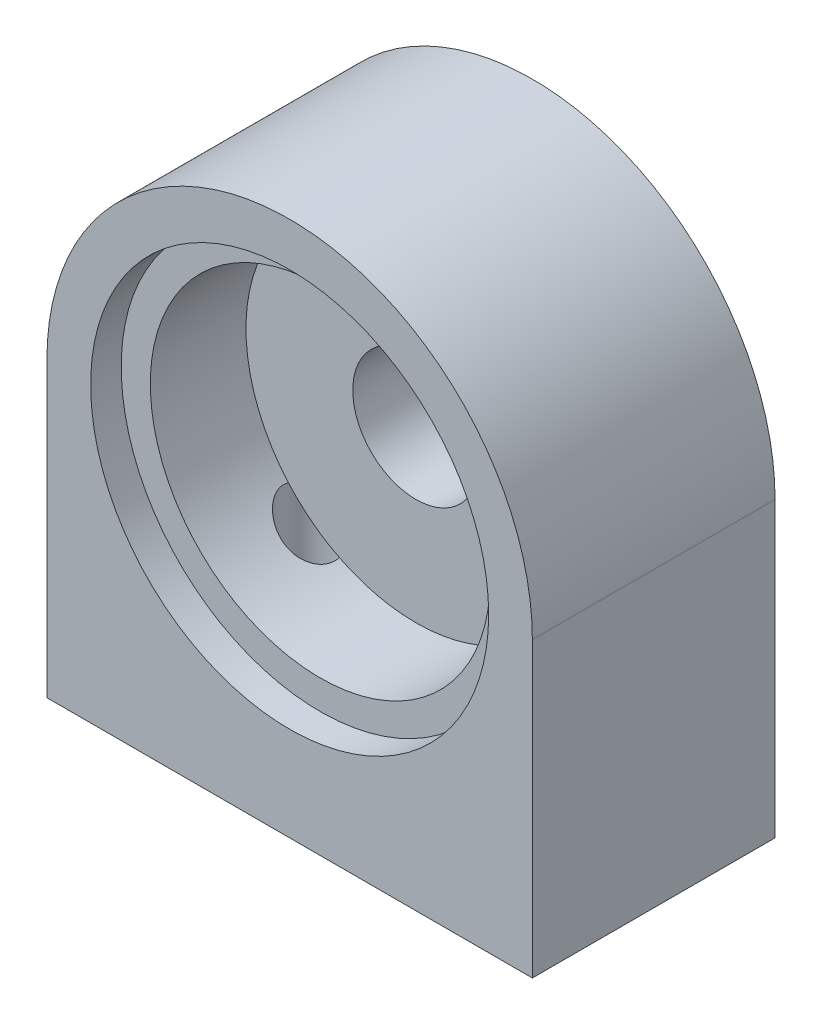
ISO-10303-21;
HEADER;
FILE_DESCRIPTION(('STEP AP214'),'2;1');
FILE_NAME('part.step','',(''),(''),'','','');
FILE_SCHEMA(('AUTOMOTIVE_DESIGN { 1 0 10303 214 1 1 1 1 }'));
ENDSEC;
DATA;
#1=APPLICATION_CONTEXT('core data for automotive mechanical design processes');
#2=APPLICATION_PROTOCOL_DEFINITION('international standard','automotive_design',2000,#1);
#3=PRODUCT_CONTEXT('',#1,'mechanical');
#4=PRODUCT('Part','Part','',(#3));
#5=PRODUCT_RELATED_PRODUCT_CATEGORY('part','',(#4));
#6=PRODUCT_DEFINITION_FORMATION('','',#4);
#7=PRODUCT_DEFINITION_CONTEXT('part definition',#1,'design');
#8=PRODUCT_DEFINITION('design','',#6,#7);
#9=PRODUCT_DEFINITION_SHAPE('','',#8);
#10=(LENGTH_UNIT() NAMED_UNIT(*) SI_UNIT(.MILLI.,.METRE.));
#11=(NAMED_UNIT(*) PLANE_ANGLE_UNIT() SI_UNIT($,.RADIAN.));
#12=(NAMED_UNIT(*) SI_UNIT($,.STERADIAN.) SOLID_ANGLE_UNIT());
#13=UNCERTAINTY_MEASURE_WITH_UNIT(LENGTH_MEASURE(1.E-05),#10,'distance_accuracy_value','');
#14=(GEOMETRIC_REPRESENTATION_CONTEXT(3) GLOBAL_UNCERTAINTY_ASSIGNED_CONTEXT((#13)) GLOBAL_UNIT_ASSIGNED_CONTEXT((#10,
#11,#12)) REPRESENTATION_CONTEXT('',''));
#15=CARTESIAN_POINT('',(0.,0.,0.));
#16=DIRECTION('',(0.,0.,1.));
#17=DIRECTION('',(1.,0.,0.));
#18=AXIS2_PLACEMENT_3D('',#15,#16,#17);
#19=CARTESIAN_POINT('',(12.7,15.33579991,6.096));
#20=DIRECTION('',(0.,0.,1.));
#21=DIRECTION('',(1.,0.,0.));
#22=AXIS2_PLACEMENT_3D('',#19,#20,#21);
#23=CYLINDRICAL_SURFACE('',#22,8.89);
#24=CARTESIAN_POINT('',(12.7,15.33579991,6.096));
#25=DIRECTION('',(0.,0.,1.));
#26=DIRECTION('',(1.,0.,0.));
#27=AXIS2_PLACEMENT_3D('',#24,#25,#26);
#28=CIRCLE('',#27,8.89);
#29=CARTESIAN_POINT('',(8.69448616948013,7.39930452768458,6.096));
#30=VERTEX_POINT('',#29);
#31=CARTESIAN_POINT('',(16.7055138305199,7.39930452768458,6.096));
#32=VERTEX_POINT('',#31);
#33=EDGE_CURVE('E61',#30,#32,#28,.T.);
#34=ORIENTED_EDGE('',*,*,#33,.F.);
#35=CARTESIAN_POINT('',(8.69448616948013,7.39930452768458,6.096));
#36=CARTESIAN_POINT('',(8.70089637097496,7.39607049212058,6.12952031807088));
#37=CARTESIAN_POINT('',(8.70604294261392,7.39348145519207,6.16332870828488));
#38=CARTESIAN_POINT('',(8.71376664533799,7.38960172566352,6.23130981924729));
#39=CARTESIAN_POINT('',(8.71634388724773,7.38831097706351,6.2654825242172));
#40=CARTESIAN_POINT('',(8.72015233335113,7.38640170053647,6.36805368374219));
#41=CARTESIAN_POINT('',(8.71749437283582,7.38772906630197,6.43668367284446));
#42=CARTESIAN_POINT('',(8.70188355730791,7.3955709273081,6.57245364131934));
#43=CARTESIAN_POINT('',(8.68892562519349,7.40208798067248,6.6395928690788));
#44=CARTESIAN_POINT('',(8.65330542406097,7.42019767319402,6.77051971335786));
#45=CARTESIAN_POINT('',(8.6306437216521,7.43179001600272,6.83430752532463));
#46=CARTESIAN_POINT('',(8.57630715812681,7.46000162725195,6.95756458721464));
#47=CARTESIAN_POINT('',(8.54453759153132,7.47667383807152,7.01697975202922));
#48=CARTESIAN_POINT('',(8.47340092368744,7.51470132592697,7.12941269712069));
#49=CARTESIAN_POINT('',(8.43403124601072,7.53605819139054,7.18242829801948));
#50=CARTESIAN_POINT('',(8.34649930960389,7.58455597156986,7.2842367313361));
#51=CARTESIAN_POINT('',(8.29793940099482,7.61197649623298,7.33255318005362));
#52=CARTESIAN_POINT('',(8.19571666357853,7.67113939230621,7.42028240123445));
#53=CARTESIAN_POINT('',(8.14205238196155,7.70288299527022,7.45969262796375));
#54=CARTESIAN_POINT('',(8.02511916213642,7.77387136118261,7.5333188661708));
#55=CARTESIAN_POINT('',(7.9614466270305,7.81355788651306,7.5664648513332));
#56=CARTESIAN_POINT('',(7.83187523920503,7.89675404609957,7.62173970536783));
#57=CARTESIAN_POINT('',(7.76597509934975,7.9402659147546,7.64386208432836));
#58=CARTESIAN_POINT('',(7.62329659569681,8.03732598014006,7.68019433633136));
#59=CARTESIAN_POINT('',(7.54641764865042,8.09138360596089,7.69264274293582));
#60=CARTESIAN_POINT('',(7.39380832052516,8.20240249841608,7.70443122036341));
#61=CARTESIAN_POINT('',(7.31807836773073,8.25936481486146,7.70376651788227));
#62=CARTESIAN_POINT('',(7.15631204737976,8.38512862151658,7.68907030326356));
#63=CARTESIAN_POINT('',(7.07075106254108,8.45427748310855,7.67275296172546));
#64=CARTESIAN_POINT('',(6.9047398887326,8.59348318977863,7.62441089758687));
#65=CARTESIAN_POINT('',(6.82429973228868,8.66354151195699,7.59235635205476));
#66=CARTESIAN_POINT('',(6.66082578807266,8.81092529583536,7.50826517721181));
#67=CARTESIAN_POINT('',(6.57865338662799,8.8881057972255,7.45428184592521));
#68=CARTESIAN_POINT('',(6.42532381718995,9.03723891260022,7.32694455162529));
#69=CARTESIAN_POINT('',(6.35413695546493,9.10920533017818,7.25364430942217));
#70=CARTESIAN_POINT('',(6.25450019466108,9.21286163260283,7.12295995875902));
#71=CARTESIAN_POINT('',(6.22093583351649,9.24844723649692,7.07253697760698));
#72=CARTESIAN_POINT('',(6.15976644651863,9.31421840516282,6.96498501283446));
#73=CARTESIAN_POINT('',(6.13215128724755,9.34441313706371,6.9078676922951));
#74=CARTESIAN_POINT('',(6.08901461301132,9.39207990838386,6.79882668157494));
#75=CARTESIAN_POINT('',(6.07218937546137,9.4108814151464,6.74800856675138));
#76=CARTESIAN_POINT('',(6.04442635296091,9.44208471525503,6.64288298404627));
#77=CARTESIAN_POINT('',(6.03348414363123,9.45449131765009,6.58857817286791));
#78=CARTESIAN_POINT('',(6.0182880108512,9.47175991257454,6.47740658621901));
#79=CARTESIAN_POINT('',(6.01408521478583,9.4765642280896,6.42052356162522));
#80=CARTESIAN_POINT('',(6.01295077813534,9.47785872790981,6.30660114502929));
#81=CARTESIAN_POINT('',(6.01601136075888,9.47435780451205,6.24956198552183));
#82=CARTESIAN_POINT('',(6.02444472675476,9.46476361255789,6.17708404846401));
#83=CARTESIAN_POINT('',(6.02666030346177,9.46224471756416,6.16070159510248));
#84=CARTESIAN_POINT('',(6.0316635419784,9.45656490549535,6.12817574559428));
#85=CARTESIAN_POINT('',(6.03444988536579,9.45340546818806,6.11203188883994));
#86=CARTESIAN_POINT('',(6.03751383051983,9.44993735286462,6.09600000000002));
#87=B_SPLINE_CURVE_WITH_KNOTS('',3,(#35,#36,#37,#38,#39,#40,#41,#42,#43,#44,#45,#46,#47,#48,#49,
#50,#51,#52,#53,#54,#55,#56,#57,#58,#59,#60,#61,#62,#63,#64,#65,#66,#67,#68,#69,#70,#71,#72,#73,
#74,#75,#76,#77,#78,#79,#80,#81,#82,#83,#84,#85,#86),.UNSPECIFIED.,.F.,.F.,(4,2,2,2,2,2,2,2,2,2,
2,2,2,2,2,2,2,2,2,2,2,2,2,2,2,4),(0.,0.102780066951622,0.205555700429577,0.410566471073732,
0.615678359132956,0.820778272213211,1.02809342379216,1.23547897876143,1.45592849911555,
1.67644095277603,1.92155494898295,2.16681308080617,2.45014494705373,2.73357995086712,
3.06590390689593,3.3988600816346,3.77205441541023,4.14422164269421,4.35438413379589,
4.5641857690736,4.7337408613723,4.90316825938211,5.07387500960213,5.24439906912117,
5.29455143621212,5.34458923617784),.UNSPECIFIED.);
#88=CARTESIAN_POINT('',(6.03751383051987,9.44993735286481,6.096));
#89=VERTEX_POINT('',#88);
#90=EDGE_CURVE('E11',#30,#89,#87,.T.);
#91=ORIENTED_EDGE('',*,*,#90,.T.);
#92=CARTESIAN_POINT('',(19.3624861694801,9.44993735286481,6.096));
#93=VERTEX_POINT('',#92);
#94=EDGE_CURVE('E109',#93,#89,#28,.T.);
#95=ORIENTED_EDGE('',*,*,#94,.F.);
#96=CARTESIAN_POINT('',(19.3624861694801,9.44993735286481,6.096));
#97=CARTESIAN_POINT('',(19.3674061420263,9.45550725096371,6.12172390675147));
#98=CARTESIAN_POINT('',(19.3716053919705,9.46027376682763,6.14775230757197));
#99=CARTESIAN_POINT('',(19.3784972042117,9.46810840676736,6.20026520138425));
#100=CARTESIAN_POINT('',(19.3811894274667,9.47117614866157,6.22674979562737));
#101=CARTESIAN_POINT('',(19.3868801513406,9.47766237596015,6.30629634690808));
#102=CARTESIAN_POINT('',(19.3875579405031,9.47843817391137,6.35978801316995));
#103=CARTESIAN_POINT('',(19.38260891038,9.47279312087916,6.4661498673138));
#104=CARTESIAN_POINT('',(19.3769709722857,9.46635957787765,6.51901879305281));
#105=CARTESIAN_POINT('',(19.3598451718809,9.44693529918134,6.62255385861771));
#106=CARTESIAN_POINT('',(19.3483528299407,9.43393954232691,6.67321827934723));
#107=CARTESIAN_POINT('',(19.3166724229339,9.39842334817548,6.78387957663208));
#108=CARTESIAN_POINT('',(19.2950102115752,9.37431505420563,6.84293808904044));
#109=CARTESIAN_POINT('',(19.2452193145333,9.31969034733475,6.95508161086445));
#110=CARTESIAN_POINT('',(19.2170758342762,9.28915928741372,7.0081525332182));
#111=CARTESIAN_POINT('',(19.1429421329572,9.21006770075361,7.12879159523257));
#112=CARTESIAN_POINT('',(19.0943806676925,9.15926739749318,7.19329997205983));
#113=CARTESIAN_POINT('',(18.9894867596642,9.0524806092916,7.31054164016303));
#114=CARTESIAN_POINT('',(18.9331423306139,8.99648616958292,7.36325643401685));
#115=CARTESIAN_POINT('',(18.7970809292713,8.86517444193151,7.47100153245381));
#116=CARTESIAN_POINT('',(18.7153069250019,8.78893775535628,7.52232377162001));
#117=CARTESIAN_POINT('',(18.5437064047285,8.63531505108527,7.6064728965497));
#118=CARTESIAN_POINT('',(18.4538739573816,8.55792822237593,7.63928602722427));
#119=CARTESIAN_POINT('',(18.267639459888,8.40412257796386,7.68568758645734));
#120=CARTESIAN_POINT('',(18.1712030305192,8.32771174464527,7.69916589395077));
#121=CARTESIAN_POINT('',(17.974841125508,8.17875711215418,7.70480807156287));
#122=CARTESIAN_POINT('',(17.8749216172226,8.10620718991907,7.69700678254245));
#123=CARTESIAN_POINT('',(17.6984427681352,7.98349198668911,7.6625905303659));
#124=CARTESIAN_POINT('',(17.6218420166414,7.9320384354365,7.64076031474628));
#125=CARTESIAN_POINT('',(17.4710527388837,7.83398553941833,7.58247882961115));
#126=CARTESIAN_POINT('',(17.3968633831135,7.78738451299175,7.54603264669978));
#127=CARTESIAN_POINT('',(17.2533270320972,7.69993469108688,7.45774303657301));
#128=CARTESIAN_POINT('',(17.1840238552192,7.65913525293212,7.40577795046014));
#129=CARTESIAN_POINT('',(17.0546763297621,7.58502864619417,7.28701612994718));
#130=CARTESIAN_POINT('',(16.9946236836753,7.55171475080487,7.22023281994338));
#131=CARTESIAN_POINT('',(16.8953566898951,7.4978268918612,7.08412410065067));
#132=CARTESIAN_POINT('',(16.8543908167258,7.4761126471687,7.01652588997993));
#133=CARTESIAN_POINT('',(16.7844258743443,7.43952641101453,6.87369866294681));
#134=CARTESIAN_POINT('',(16.7554181843269,7.42464948954837,6.79847519264487));
#135=CARTESIAN_POINT('',(16.7136983757922,7.40341012361535,6.65216181512104));
#136=CARTESIAN_POINT('',(16.6994823993438,7.39625811984842,6.58161006952399));
#137=CARTESIAN_POINT('',(16.6824645650314,7.38770743200455,6.43883515878215));
#138=CARTESIAN_POINT('',(16.6796477709817,7.38630121927631,6.36661430559028));
#139=CARTESIAN_POINT('',(16.6839423009107,7.38845450065019,6.26132324117521));
#140=CARTESIAN_POINT('',(16.686552534026,7.38976194496679,6.22795563841931));
#141=CARTESIAN_POINT('',(16.6942161278778,7.39361167981178,6.16163534853525));
#142=CARTESIAN_POINT('',(16.6992650539216,7.39615172892287,6.12868201923614));
#143=CARTESIAN_POINT('',(16.7055138305199,7.39930452768458,6.096));
#144=B_SPLINE_CURVE_WITH_KNOTS('',3,(#96,#97,#98,#99,#100,#101,#102,#103,#104,#105,#106,#107,
#108,#109,#110,#111,#112,#113,#114,#115,#116,#117,#118,#119,#120,#121,#122,#123,#124,#125,#126,
#127,#128,#129,#130,#131,#132,#133,#134,#135,#136,#137,#138,#139,#140,#141,#142,#143),
.UNSPECIFIED.,.F.,.F.,(4,2,2,2,2,2,2,2,2,2,2,2,2,2,2,2,2,2,2,2,2,2,2,4),(0.,0.0802865762053408,
0.160591207549519,0.320161749646303,0.48001365704697,0.639988062888501,0.840984500701857,
1.04244437555383,1.32707186957749,1.61214270043069,1.97933991084625,2.34680964645463,
2.71636409988985,3.08531384902934,3.36866596439408,3.65191955388143,3.93745472871608,
4.22273227486362,4.46724115290985,4.71157345185881,4.92746348834385,5.14307055542929,
5.24345925989717,5.34366609378857),.UNSPECIFIED.);
#145=EDGE_CURVE('E47',#93,#32,#144,.T.);
#146=ORIENTED_EDGE('',*,*,#145,.T.);
#147=EDGE_LOOP('',(#34,#91,#95,#146));
#148=FACE_BOUND('',#147,.T.);
#149=CARTESIAN_POINT('',(12.7,15.33579991,11.0998));
#150=DIRECTION('',(0.,0.,1.));
#151=DIRECTION('',(1.,0.,0.));
#152=AXIS2_PLACEMENT_3D('',#149,#150,#151);
#153=CIRCLE('',#152,8.89);
#154=CARTESIAN_POINT('',(21.59,15.33579991,11.0998));
#155=VERTEX_POINT('',#154);
#156=EDGE_CURVE('E104',#155,#155,#153,.F.);
#157=ORIENTED_EDGE('',*,*,#156,.F.);
#158=EDGE_LOOP('',(#157));
#159=FACE_BOUND('',#158,.T.);
#160=ADVANCED_FACE('F35',(#148,#159),#23,.F.);
#161=CARTESIAN_POINT('',(12.7,15.33579991,0.));
#162=DIRECTION('',(0.,0.,1.));
#163=DIRECTION('',(1.,0.,0.));
#164=AXIS2_PLACEMENT_3D('',#161,#162,#163);
#165=CYLINDRICAL_SURFACE('',#164,3.302);
#166=CARTESIAN_POINT('',(12.7,15.33579991,0.));
#167=DIRECTION('',(0.,0.,1.));
#168=DIRECTION('',(1.,0.,0.));
#169=AXIS2_PLACEMENT_3D('',#166,#167,#168);
#170=CIRCLE('',#169,3.302);
#171=CARTESIAN_POINT('',(16.002,15.33579991,0.));
#172=VERTEX_POINT('',#171);
#173=EDGE_CURVE('E115',#172,#172,#170,.T.);
#174=ORIENTED_EDGE('',*,*,#173,.F.);
#175=EDGE_LOOP('',(#174));
#176=FACE_BOUND('',#175,.T.);
#177=CARTESIAN_POINT('',(12.7,15.33579991,6.096));
#178=DIRECTION('',(0.,0.,1.));
#179=DIRECTION('',(1.,0.,0.));
#180=AXIS2_PLACEMENT_3D('',#177,#178,#179);
#181=CIRCLE('',#180,3.302);
#182=CARTESIAN_POINT('',(16.002,15.33579991,6.096));
#183=VERTEX_POINT('',#182);
#184=EDGE_CURVE('E112',#183,#183,#181,.F.);
#185=ORIENTED_EDGE('',*,*,#184,.F.);
#186=EDGE_LOOP('',(#185));
#187=FACE_BOUND('',#186,.T.);
#188=ADVANCED_FACE('F164',(#176,#187),#165,.F.);
#189=CARTESIAN_POINT('',(0.,0.,12.7));
#190=DIRECTION('',(1.,0.,0.));
#191=DIRECTION('',(0.,0.,-1.));
#192=AXIS2_PLACEMENT_3D('',#189,#190,#191);
#193=PLANE('',#192);
#194=DIRECTION('',(0.,-1.,0.));
#195=VECTOR('',#194,1.);
#196=CARTESIAN_POINT('',(0.,0.,0.));
#197=LINE('',#196,#195);
#198=CARTESIAN_POINT('',(0.,15.33579991,0.));
#199=VERTEX_POINT('',#198);
#200=CARTESIAN_POINT('',(0.,0.,0.));
#201=VERTEX_POINT('',#200);
#202=EDGE_CURVE('E118',#199,#201,#197,.T.);
#203=ORIENTED_EDGE('',*,*,#202,.T.);
#204=DIRECTION('',(0.,0.,-1.));
#205=VECTOR('',#204,1.);
#206=CARTESIAN_POINT('',(0.,0.,12.7));
#207=LINE('',#206,#205);
#208=CARTESIAN_POINT('',(0.,0.,12.7));
#209=VERTEX_POINT('',#208);
#210=EDGE_CURVE('E145',#209,#201,#207,.T.);
#211=ORIENTED_EDGE('',*,*,#210,.F.);
#212=DIRECTION('',(0.,-1.,0.));
#213=VECTOR('',#212,1.);
#214=CARTESIAN_POINT('',(0.,0.,12.7));
#215=LINE('',#214,#213);
#216=CARTESIAN_POINT('',(0.,15.33579991,12.7));
#217=VERTEX_POINT('',#216);
#218=EDGE_CURVE('E119',#217,#209,#215,.T.);
#219=ORIENTED_EDGE('',*,*,#218,.F.);
#220=DIRECTION('',(0.,0.,-1.));
#221=VECTOR('',#220,1.);
#222=CARTESIAN_POINT('',(0.,15.33579991,12.7));
#223=LINE('',#222,#221);
#224=EDGE_CURVE('E129',#217,#199,#223,.T.);
#225=ORIENTED_EDGE('',*,*,#224,.T.);
#226=EDGE_LOOP('',(#203,#211,#219,#225));
#227=FACE_BOUND('',#226,.T.);
#228=ADVANCED_FACE('F160',(#227),#193,.F.);
#229=CARTESIAN_POINT('',(0.,0.,12.7));
#230=DIRECTION('',(0.,1.,0.));
#231=DIRECTION('',(0.,0.,1.));
#232=AXIS2_PLACEMENT_3D('',#229,#230,#231);
#233=PLANE('',#232);
#234=CARTESIAN_POINT('',(7.366,0.,6.35));
#235=DIRECTION('',(0.,-1.,0.));
#236=DIRECTION('',(0.,0.,-1.));
#237=AXIS2_PLACEMENT_3D('',#234,#235,#236);
#238=CIRCLE('',#237,1.35255);
#239=CARTESIAN_POINT('',(7.366,0.,4.99745));
#240=VERTEX_POINT('',#239);
#241=EDGE_CURVE('E100',#240,#240,#238,.T.);
#242=ORIENTED_EDGE('',*,*,#241,.F.);
#243=EDGE_LOOP('',(#242));
#244=FACE_BOUND('',#243,.T.);
#245=CARTESIAN_POINT('',(18.034,0.,6.35));
#246=DIRECTION('',(0.,-1.,0.));
#247=DIRECTION('',(0.,0.,-1.));
#248=AXIS2_PLACEMENT_3D('',#245,#246,#247);
#249=CIRCLE('',#248,1.35255);
#250=CARTESIAN_POINT('',(18.034,0.,4.99745000000001));
#251=VERTEX_POINT('',#250);
#252=EDGE_CURVE('E99',#251,#251,#249,.T.);
#253=ORIENTED_EDGE('',*,*,#252,.F.);
#254=EDGE_LOOP('',(#253));
#255=FACE_BOUND('',#254,.T.);
#256=DIRECTION('',(1.,0.,0.));
#257=VECTOR('',#256,1.);
#258=CARTESIAN_POINT('',(0.,0.,0.));
#259=LINE('',#258,#257);
#260=CARTESIAN_POINT('',(25.4,0.,0.));
#261=VERTEX_POINT('',#260);
#262=EDGE_CURVE('E132',#201,#261,#259,.T.);
#263=ORIENTED_EDGE('',*,*,#262,.T.);
#264=DIRECTION('',(0.,0.,-1.));
#265=VECTOR('',#264,1.);
#266=CARTESIAN_POINT('',(25.4,0.,12.7));
#267=LINE('',#266,#265);
#268=CARTESIAN_POINT('',(25.4,0.,12.7));
#269=VERTEX_POINT('',#268);
#270=EDGE_CURVE('E142',#269,#261,#267,.T.);
#271=ORIENTED_EDGE('',*,*,#270,.F.);
#272=DIRECTION('',(1.,0.,0.));
#273=VECTOR('',#272,1.);
#274=CARTESIAN_POINT('',(0.,0.,12.7));
#275=LINE('',#274,#273);
#276=EDGE_CURVE('E122',#209,#269,#275,.T.);
#277=ORIENTED_EDGE('',*,*,#276,.F.);
#278=ORIENTED_EDGE('',*,*,#210,.T.);
#279=EDGE_LOOP('',(#263,#271,#277,#278));
#280=FACE_BOUND('',#279,.T.);
#281=ADVANCED_FACE('F163',(#244,#255,#280),#233,.F.);
#282=CARTESIAN_POINT('',(25.4,0.,12.7));
#283=DIRECTION('',(-1.,0.,0.));
#284=DIRECTION('',(0.,0.,1.));
#285=AXIS2_PLACEMENT_3D('',#282,#283,#284);
#286=PLANE('',#285);
#287=DIRECTION('',(0.,1.,0.));
#288=VECTOR('',#287,1.);
#289=CARTESIAN_POINT('',(25.4,0.,0.));
#290=LINE('',#289,#288);
#291=CARTESIAN_POINT('',(25.4,15.33579991,0.));
#292=VERTEX_POINT('',#291);
#293=EDGE_CURVE('E134',#261,#292,#290,.T.);
#294=ORIENTED_EDGE('',*,*,#293,.T.);
#295=DIRECTION('',(0.,0.,-1.));
#296=VECTOR('',#295,1.);
#297=CARTESIAN_POINT('',(25.4,15.33579991,12.7));
#298=LINE('',#297,#296);
#299=CARTESIAN_POINT('',(25.4,15.33579991,12.7));
#300=VERTEX_POINT('',#299);
#301=EDGE_CURVE('E139',#300,#292,#298,.T.);
#302=ORIENTED_EDGE('',*,*,#301,.F.);
#303=DIRECTION('',(0.,1.,0.));
#304=VECTOR('',#303,1.);
#305=CARTESIAN_POINT('',(25.4,0.,12.7));
#306=LINE('',#305,#304);
#307=EDGE_CURVE('E125',#269,#300,#306,.T.);
#308=ORIENTED_EDGE('',*,*,#307,.F.);
#309=ORIENTED_EDGE('',*,*,#270,.T.);
#310=EDGE_LOOP('',(#294,#302,#308,#309));
#311=FACE_BOUND('',#310,.T.);
#312=ADVANCED_FACE('F168',(#311),#286,.F.);
#313=CARTESIAN_POINT('',(12.7,15.33579991,12.7));
#314=DIRECTION('',(0.,0.,-1.));
#315=DIRECTION('',(-1.,0.,0.));
#316=AXIS2_PLACEMENT_3D('',#313,#314,#315);
#317=CYLINDRICAL_SURFACE('',#316,12.7);
#318=CARTESIAN_POINT('',(12.7,15.33579991,0.));
#319=DIRECTION('',(0.,0.,1.));
#320=DIRECTION('',(1.,0.,0.));
#321=AXIS2_PLACEMENT_3D('',#318,#319,#320);
#322=CIRCLE('',#321,12.7);
#323=EDGE_CURVE('E123',#292,#199,#322,.T.);
#324=ORIENTED_EDGE('',*,*,#323,.T.);
#325=ORIENTED_EDGE('',*,*,#224,.F.);
#326=CARTESIAN_POINT('',(12.7,15.33579991,12.7));
#327=DIRECTION('',(0.,0.,1.));
#328=DIRECTION('',(1.,0.,0.));
#329=AXIS2_PLACEMENT_3D('',#326,#327,#328);
#330=CIRCLE('',#329,12.7);
#331=EDGE_CURVE('E127',#300,#217,#330,.T.);
#332=ORIENTED_EDGE('',*,*,#331,.F.);
#333=ORIENTED_EDGE('',*,*,#301,.T.);
#334=EDGE_LOOP('',(#324,#325,#332,#333));
#335=FACE_BOUND('',#334,.T.);
#336=ADVANCED_FACE('F172',(#335),#317,.T.);
#337=CARTESIAN_POINT('',(12.7,15.33579991,12.7));
#338=DIRECTION('',(0.,0.,1.));
#339=DIRECTION('',(1.,0.,0.));
#340=AXIS2_PLACEMENT_3D('',#337,#338,#339);
#341=PLANE('',#340);
#342=CARTESIAN_POINT('',(12.7,15.33579991,12.7));
#343=DIRECTION('',(0.,0.,1.));
#344=DIRECTION('',(1.,0.,0.));
#345=AXIS2_PLACEMENT_3D('',#342,#343,#344);
#346=CIRCLE('',#345,10.414);
#347=CARTESIAN_POINT('',(23.114,15.33579991,12.7));
#348=VERTEX_POINT('',#347);
#349=EDGE_CURVE('E113',#348,#348,#346,.T.);
#350=ORIENTED_EDGE('',*,*,#349,.F.);
#351=EDGE_LOOP('',(#350));
#352=FACE_BOUND('',#351,.T.);
#353=ORIENTED_EDGE('',*,*,#218,.T.);
#354=ORIENTED_EDGE('',*,*,#276,.T.);
#355=ORIENTED_EDGE('',*,*,#307,.T.);
#356=ORIENTED_EDGE('',*,*,#331,.T.);
#357=EDGE_LOOP('',(#353,#354,#355,#356));
#358=FACE_BOUND('',#357,.T.);
#359=ADVANCED_FACE('F176',(#352,#358),#341,.T.);
#360=CARTESIAN_POINT('',(12.7,15.33579991,0.));
#361=DIRECTION('',(0.,0.,1.));
#362=DIRECTION('',(1.,0.,0.));
#363=AXIS2_PLACEMENT_3D('',#360,#361,#362);
#364=PLANE('',#363);
#365=ORIENTED_EDGE('',*,*,#173,.T.);
#366=EDGE_LOOP('',(#365));
#367=FACE_BOUND('',#366,.T.);
#368=ORIENTED_EDGE('',*,*,#202,.F.);
#369=ORIENTED_EDGE('',*,*,#323,.F.);
#370=ORIENTED_EDGE('',*,*,#293,.F.);
#371=ORIENTED_EDGE('',*,*,#262,.F.);
#372=EDGE_LOOP('',(#368,#369,#370,#371));
#373=FACE_BOUND('',#372,.T.);
#374=ADVANCED_FACE('F178',(#367,#373),#364,.F.);
#375=CARTESIAN_POINT('',(12.7,15.33579991,6.096));
#376=DIRECTION('',(0.,0.,1.));
#377=DIRECTION('',(1.,0.,0.));
#378=AXIS2_PLACEMENT_3D('',#375,#376,#377);
#379=PLANE('',#378);
#380=EDGE_CURVE('E106',#32,#93,#28,.T.);
#381=ORIENTED_EDGE('',*,*,#380,.T.);
#382=ORIENTED_EDGE('',*,*,#94,.T.);
#383=EDGE_CURVE('E98',#89,#30,#28,.T.);
#384=ORIENTED_EDGE('',*,*,#383,.T.);
#385=ORIENTED_EDGE('',*,*,#33,.T.);
#386=EDGE_LOOP('',(#381,#382,#384,#385));
#387=FACE_BOUND('',#386,.T.);
#388=ORIENTED_EDGE('',*,*,#184,.T.);
#389=EDGE_LOOP('',(#388));
#390=FACE_BOUND('',#389,.T.);
#391=ADVANCED_FACE('F107',(#387,#390),#379,.T.);
#392=CARTESIAN_POINT('',(12.7,15.33579991,11.0998));
#393=DIRECTION('',(0.,0.,1.));
#394=DIRECTION('',(1.,0.,0.));
#395=AXIS2_PLACEMENT_3D('',#392,#393,#394);
#396=PLANE('',#395);
#397=CARTESIAN_POINT('',(12.7,15.33579991,11.0998));
#398=DIRECTION('',(0.,0.,1.));
#399=DIRECTION('',(1.,0.,0.));
#400=AXIS2_PLACEMENT_3D('',#397,#398,#399);
#401=CIRCLE('',#400,10.414);
#402=CARTESIAN_POINT('',(23.114,15.33579991,11.0998));
#403=VERTEX_POINT('',#402);
#404=EDGE_CURVE('E151',#403,#403,#401,.T.);
#405=ORIENTED_EDGE('',*,*,#404,.T.);
#406=EDGE_LOOP('',(#405));
#407=FACE_BOUND('',#406,.T.);
#408=ORIENTED_EDGE('',*,*,#156,.T.);
#409=EDGE_LOOP('',(#408));
#410=FACE_BOUND('',#409,.T.);
#411=ADVANCED_FACE('F193',(#407,#410),#396,.T.);
#412=CARTESIAN_POINT('',(12.7,15.33579991,11.0998));
#413=DIRECTION('',(0.,0.,1.));
#414=DIRECTION('',(1.,0.,0.));
#415=AXIS2_PLACEMENT_3D('',#412,#413,#414);
#416=CYLINDRICAL_SURFACE('',#415,10.414);
#417=ORIENTED_EDGE('',*,*,#404,.F.);
#418=EDGE_LOOP('',(#417));
#419=FACE_BOUND('',#418,.T.);
#420=ORIENTED_EDGE('',*,*,#349,.T.);
#421=EDGE_LOOP('',(#420));
#422=FACE_BOUND('',#421,.T.);
#423=ADVANCED_FACE('F197',(#419,#422),#416,.F.);
#424=CARTESIAN_POINT('',(18.034,0.,6.35));
#425=DIRECTION('',(0.,-1.,0.));
#426=DIRECTION('',(0.,0.,-1.));
#427=AXIS2_PLACEMENT_3D('',#424,#425,#426);
#428=CYLINDRICAL_SURFACE('',#427,1.35255);
#429=CARTESIAN_POINT('',(18.034,8.22379991,4.99745000000001));
#430=CARTESIAN_POINT('',(17.9419091075867,8.15473576374474,4.99745044525444));
#431=CARTESIAN_POINT('',(17.8483439019677,8.08738118923386,5.00684946753768));
#432=CARTESIAN_POINT('',(17.6615381898376,7.95825937699459,5.04625226983884));
#433=CARTESIAN_POINT('',(17.5682976639641,7.89649180040139,5.07625479925505));
#434=CARTESIAN_POINT('',(17.4104080824169,7.79587064134075,5.14752321603741));
#435=CARTESIAN_POINT('',(17.3446407256731,7.75524066352092,5.18381572213229));
#436=CARTESIAN_POINT('',(17.2181206331332,7.67916111002268,5.26855827224653));
#437=CARTESIAN_POINT('',(17.1573637904778,7.64370727299095,5.31699822533575));
#438=CARTESIAN_POINT('',(17.043131396234,7.57863092041507,5.42596523432221));
#439=CARTESIAN_POINT('',(16.989706291306,7.54904823611467,5.48656959175908));
#440=CARTESIAN_POINT('',(16.8935071243991,7.49681991687293,5.61835247793327));
#441=CARTESIAN_POINT('',(16.8507279046041,7.47417092140534,5.68952585929994));
#442=CARTESIAN_POINT('',(16.7826285516714,7.43861354125405,5.83142025407171));
#443=CARTESIAN_POINT('',(16.7558618973857,7.42488185336956,5.90124260458751));
#444=CARTESIAN_POINT('',(16.7141119964322,7.40361469211537,6.045214847017));
#445=CARTESIAN_POINT('',(16.6991220481008,7.39607569461595,6.11936225186506));
#446=CARTESIAN_POINT('',(16.6824314845864,7.38769216778487,6.26345179018564));
#447=CARTESIAN_POINT('',(16.6797631108934,7.38636005467038,6.33325541675161));
#448=CARTESIAN_POINT('',(16.6851981644613,7.38908325189322,6.4723270842014));
#449=CARTESIAN_POINT('',(16.6932992300144,7.39313738104258,6.54159523916244));
#450=CARTESIAN_POINT('',(16.7195999574581,7.40641635378231,6.67609945051897));
#451=CARTESIAN_POINT('',(16.7375791477641,7.41552835404102,6.74139013810062));
#452=CARTESIAN_POINT('',(16.7826850787017,7.43868518050555,6.8677899531766));
#453=CARTESIAN_POINT('',(16.8098122586294,7.45273024360364,6.92889887968877));
#454=CARTESIAN_POINT('',(16.8729466795322,7.48596440964101,7.04710834515789));
#455=CARTESIAN_POINT('',(16.9091785825824,7.5052849292381,7.10405146543418));
#456=CARTESIAN_POINT('',(16.9886428332689,7.54852275523054,7.2108451024687));
#457=CARTESIAN_POINT('',(17.0318768573333,7.57244116269629,7.26069391534491));
#458=CARTESIAN_POINT('',(17.127249328852,7.62640444060089,7.35601956897361));
#459=CARTESIAN_POINT('',(17.1798130625382,7.65677493399737,7.40088493012658));
#460=CARTESIAN_POINT('',(17.289348633143,7.72173147288581,7.48115129606391));
#461=CARTESIAN_POINT('',(17.3463222834716,7.75631925597652,7.51654838043485));
#462=CARTESIAN_POINT('',(17.4702061032178,7.83358759808898,7.5816699147318));
#463=CARTESIAN_POINT('',(17.5374736195509,7.87673998113701,7.61015099902626));
#464=CARTESIAN_POINT('',(17.6734250201501,7.96668841087646,7.65557370896147));
#465=CARTESIAN_POINT('',(17.7421096205746,8.01348633482161,7.67250934497258));
#466=CARTESIAN_POINT('',(17.8905303582986,8.11776748693651,7.69735142871371));
#467=CARTESIAN_POINT('',(17.9702390492309,8.17574744480737,7.70333107597649));
#468=CARTESIAN_POINT('',(18.1275791277353,8.29426491848123,7.70160457945116));
#469=CARTESIAN_POINT('',(18.2052089585225,8.35480426801018,7.69388845510526));
#470=CARTESIAN_POINT('',(18.3698303973866,8.48758151587847,7.6632995359936));
#471=CARTESIAN_POINT('',(18.4561896129157,8.56006878156167,7.63808761812364));
#472=CARTESIAN_POINT('',(18.6224693342388,8.7049160591174,7.57112232124563));
#473=CARTESIAN_POINT('',(18.7023857003632,8.77727596040986,7.52935840756641));
#474=CARTESIAN_POINT('',(18.8449908015059,8.91088087710386,7.43539894037645));
#475=CARTESIAN_POINT('',(18.9085987695611,8.97242678510743,7.38502641839524));
#476=CARTESIAN_POINT('',(19.0278146362931,9.09097177255327,7.27114264104087));
#477=CARTESIAN_POINT('',(19.0834364688011,9.14797869202351,7.20765475276922));
#478=CARTESIAN_POINT('',(19.1682178030394,9.23688456796117,7.08920994392096));
#479=CARTESIAN_POINT('',(19.2001751766238,9.27101254505598,7.03793323977959));
#480=CARTESIAN_POINT('',(19.2579805792987,9.33356741582215,6.92884278978395));
#481=CARTESIAN_POINT('',(19.2838380161937,9.36200307823606,6.87103931635795));
#482=CARTESIAN_POINT('',(19.3234346062918,9.40596748302134,6.76160744176352));
#483=CARTESIAN_POINT('',(19.3385646847375,9.42294152996018,6.71107135655411));
#484=CARTESIAN_POINT('',(19.3629970956231,9.45048664342755,6.60692409168498));
#485=CARTESIAN_POINT('',(19.3723049284058,9.46106375290281,6.55331586674685));
#486=CARTESIAN_POINT('',(19.384398510984,9.47482674467231,6.44407257734153));
#487=CARTESIAN_POINT('',(19.3871448407245,9.47796795268829,6.38842729164794));
#488=CARTESIAN_POINT('',(19.3857385353488,9.47636297861833,6.27733921823509));
#489=CARTESIAN_POINT('',(19.3815859276255,9.47161682784992,6.22189642971268));
#490=CARTESIAN_POINT('',(19.3674413296753,9.45554287127553,6.11798980673678));
#491=CARTESIAN_POINT('',(19.3580083865353,9.44484570757877,6.06934689222579));
#492=CARTESIAN_POINT('',(19.3343680247534,9.41823475814178,5.97474574756446));
#493=CARTESIAN_POINT('',(19.320158449602,9.40231861626554,5.92878874104337));
#494=CARTESIAN_POINT('',(19.2801859701423,9.35796626688693,5.81975605223404));
#495=CARTESIAN_POINT('',(19.2521135920757,9.3271363210134,5.75850208309435));
#496=CARTESIAN_POINT('',(19.1891724826247,9.25921391237259,5.64339186935141));
#497=CARTESIAN_POINT('',(19.1542869295064,9.22210598021584,5.58955450919228));
#498=CARTESIAN_POINT('',(19.0635542478045,9.12748779733634,5.4683655174872));
#499=CARTESIAN_POINT('',(19.0050127281519,9.06789694176225,5.40466393205111));
#500=CARTESIAN_POINT('',(18.8797452657484,8.94434989511004,5.29110144516159));
#501=CARTESIAN_POINT('',(18.8130074589538,8.88038743696856,5.24126095616533));
#502=CARTESIAN_POINT('',(18.6708932536036,8.74867613476026,5.15378851824441));
#503=CARTESIAN_POINT('',(18.5953184070637,8.68087125942253,5.11656556934756));
#504=CARTESIAN_POINT('',(18.4387511877002,8.54540131344643,5.05672201625083));
#505=CARTESIAN_POINT('',(18.3577716029587,8.47773627780541,5.03406820387829));
#506=CARTESIAN_POINT('',(18.2354745005431,8.37927886351185,5.01194357213216));
#507=CARTESIAN_POINT('',(18.1957006624288,8.34781337608572,5.00654627631503));
#508=CARTESIAN_POINT('',(18.1153816617866,8.28538616031512,4.99929764100611));
#509=CARTESIAN_POINT('',(18.0748357775006,8.25442495918609,4.99744980256125));
#510=CARTESIAN_POINT('',(18.034,8.22379991,4.99745000000001));
#511=B_SPLINE_CURVE_WITH_KNOTS('',3,(#429,#430,#431,#432,#433,#434,#435,#436,#437,#438,#439,
#440,#441,#442,#443,#444,#445,#446,#447,#448,#449,#450,#451,#452,#453,#454,#455,#456,#457,#458,
#459,#460,#461,#462,#463,#464,#465,#466,#467,#468,#469,#470,#471,#472,#473,#474,#475,#476,#477,
#478,#479,#480,#481,#482,#483,#484,#485,#486,#487,#488,#489,#490,#491,#492,#493,#494,#495,#496,
#497,#498,#499,#500,#501,#502,#503,#504,#505,#506,#507,#508,#509,#510),.UNSPECIFIED.,.T.,.F.,(4,
2,2,2,2,2,2,2,2,2,2,2,2,2,2,2,2,2,2,2,2,2,2,2,2,2,2,2,2,2,2,2,2,2,2,2,2,2,2,2,4),(0.,
0.345131822939083,0.690242698750224,0.945409885433734,1.20036580189093,1.45699633741372,
1.71350229509246,1.94035871100743,2.16708593809749,2.37566358782253,2.58419550459745,
2.78825182916844,2.99231795413705,3.20202285014468,3.41177802753183,3.63732110930115,
3.86295743487723,4.11650537326846,4.37018474916417,4.66530239359528,4.96063518823421,
5.30583277213314,5.65125041397135,5.95572888027468,6.25966947758405,6.46721589564807,
6.67444009538667,6.84003425426393,7.00547173721572,7.17190065984308,7.33832892164989,
7.48978201206054,7.64130357114421,7.8623548894927,8.08395904546475,8.39743166301753,
8.71136349867381,9.03466963384171,9.35723620434228,9.51012695460947,9.66316843309422),.UNSPECIFIED.);
#512=EDGE_CURVE('E213',#93,#32,#511,.T.);
#513=ORIENTED_EDGE('',*,*,#512,.T.);
#514=ORIENTED_EDGE('',*,*,#145,.F.);
#515=EDGE_LOOP('',(#513,#514));
#516=FACE_BOUND('',#515,.T.);
#517=ORIENTED_EDGE('',*,*,#252,.T.);
#518=EDGE_LOOP('',(#517));
#519=FACE_BOUND('',#518,.T.);
#520=ADVANCED_FACE('F202',(#516,#519),#428,.F.);
#521=CARTESIAN_POINT('',(12.7,15.33579991,6.096));
#522=DIRECTION('',(0.,0.,1.));
#523=DIRECTION('',(1.,0.,0.));
#524=AXIS2_PLACEMENT_3D('',#521,#522,#523);
#525=CYLINDRICAL_SURFACE('',#524,8.89);
#526=ORIENTED_EDGE('',*,*,#512,.F.);
#527=ORIENTED_EDGE('',*,*,#380,.F.);
#528=EDGE_LOOP('',(#526,#527));
#529=FACE_BOUND('',#528,.T.);
#530=ADVANCED_FACE('F208',(#529),#525,.T.);
#531=CARTESIAN_POINT('',(7.366,0.,6.35));
#532=DIRECTION('',(0.,-1.,0.));
#533=DIRECTION('',(0.,0.,-1.));
#534=AXIS2_PLACEMENT_3D('',#531,#532,#533);
#535=CYLINDRICAL_SURFACE('',#534,1.35255);
#536=CARTESIAN_POINT('',(7.366,8.22379991,4.99745));
#537=CARTESIAN_POINT('',(7.27438610371705,8.29251315455082,4.99744979825591));
#538=CARTESIAN_POINT('',(7.1840886001338,8.36302466113013,5.00674791526974));
#539=CARTESIAN_POINT('',(7.00824009498017,8.50580355026886,5.04253124719515));
#540=CARTESIAN_POINT('',(6.92269834429944,8.57807398709716,5.06904876903956));
#541=CARTESIAN_POINT('',(6.75263573923156,8.72712533770982,5.14075835971627));
#542=CARTESIAN_POINT('',(6.66857127328442,8.80388237345393,5.18708740764505));
#543=CARTESIAN_POINT('',(6.51009671375465,8.95387045720808,5.29825106414083));
#544=CARTESIAN_POINT('',(6.43566967363856,9.02710754804929,5.36305252993726));
#545=CARTESIAN_POINT('',(6.32449831870533,9.13992270781241,5.48470033568248));
#546=CARTESIAN_POINT('',(6.28393868620463,9.18200158136334,5.53576218544776));
#547=CARTESIAN_POINT('',(6.20919616976188,9.26089298284433,5.64599906105858));
#548=CARTESIAN_POINT('',(6.17500224961683,9.29771459892151,5.70515973099693));
#549=CARTESIAN_POINT('',(6.12169508541925,9.35590052115379,5.81707734642898));
#550=CARTESIAN_POINT('',(6.10092159130188,9.37887344052576,5.86819612322056));
#551=CARTESIAN_POINT('',(6.06532290053573,9.41854787508333,5.97479471919875));
#552=CARTESIAN_POINT('',(6.05049275541663,9.43525460679059,6.0302708641867));
#553=CARTESIAN_POINT('',(6.02778378812271,9.4609435484295,6.14502158445209));
#554=CARTESIAN_POINT('',(6.01997515828579,9.46984773629603,6.20432829742638));
#555=CARTESIAN_POINT('',(6.01237114320709,9.47851726623744,6.32410266664702));
#556=CARTESIAN_POINT('',(6.01256874797036,9.4782906029854,6.38456926096811));
#557=CARTESIAN_POINT('',(6.02030212977424,9.46947607882297,6.49527348731857));
#558=CARTESIAN_POINT('',(6.02674448413562,9.46213410951628,6.54569737825669));
#559=CARTESIAN_POINT('',(6.0449101582395,9.44155977834268,6.64433179544989));
#560=CARTESIAN_POINT('',(6.05663629134518,9.42832427849287,6.6925411274681));
#561=CARTESIAN_POINT('',(6.08935260725393,9.39170879393888,6.80142037621644));
#562=CARTESIAN_POINT('',(6.11212639040498,9.36641930909455,6.86090758101355));
#563=CARTESIAN_POINT('',(6.16419231695015,9.30945671660083,6.9736387904088));
#564=CARTESIAN_POINT('',(6.19349794740841,9.27777041364459,7.02686952409424));
#565=CARTESIAN_POINT('',(6.2705477074598,9.19588533355932,7.14776868208238));
#566=CARTESIAN_POINT('',(6.32089638739918,9.14346140326038,7.21225974783433));
#567=CARTESIAN_POINT('',(6.42945397220491,9.0335490228618,7.32910679758246));
#568=CARTESIAN_POINT('',(6.48767638677826,8.9760519285224,7.38144149484167));
#569=CARTESIAN_POINT('',(6.6270730526712,8.84247307379049,7.48708376239964));
#570=CARTESIAN_POINT('',(6.71019083703181,8.76557824729401,7.53680986998675));
#571=CARTESIAN_POINT('',(6.88435050663917,8.61092676477876,7.61752380975323));
#572=CARTESIAN_POINT('',(6.97539713830389,8.533169617193,7.64850032849789));
#573=CARTESIAN_POINT('',(7.16378480535571,8.37898337768544,7.69084294591112));
#574=CARTESIAN_POINT('',(7.26115243946393,8.30256188020501,7.70211974304216));
#575=CARTESIAN_POINT('',(7.45905895024966,8.15388702689954,7.70295458830167));
#576=CARTESIAN_POINT('',(7.55959210055054,8.08162674601848,7.69254985905351));
#577=CARTESIAN_POINT('',(7.73541014811086,7.96060964680144,7.65343266500839));
#578=CARTESIAN_POINT('',(7.8108552716868,7.91042749125083,7.62982144565801));
#579=CARTESIAN_POINT('',(7.9590214892877,7.81496456826694,7.56825338250657));
#580=CARTESIAN_POINT('',(8.0317435941556,7.76968196997694,7.53030192131918));
#581=CARTESIAN_POINT('',(8.17203678950418,7.68488971410787,7.43937402412282));
#582=CARTESIAN_POINT('',(8.23956268654739,7.64542844954239,7.38628134675333));
#583=CARTESIAN_POINT('',(8.36515808340488,7.57393970934333,7.26576449609377));
#584=CARTESIAN_POINT('',(8.42323571874444,7.54190582806645,7.19835276895012));
#585=CARTESIAN_POINT('',(8.51895349314551,7.49019600882684,7.06138577848034));
#586=CARTESIAN_POINT('',(8.55831585735538,7.46941839264203,6.99344835325836));
#587=CARTESIAN_POINT('',(8.62507224703088,7.43462965229992,6.85034463331867));
#588=CARTESIAN_POINT('',(8.65247590162412,7.42061308320022,6.77518421427001));
#589=CARTESIAN_POINT('',(8.69136529325884,7.40085386651009,6.62903929846436));
#590=CARTESIAN_POINT('',(8.70429600563811,7.39435725542557,6.55853761511985));
#591=CARTESIAN_POINT('',(8.71882715189361,7.38706207920946,6.41609334758894));
#592=CARTESIAN_POINT('',(8.72043179254855,7.38626139846984,6.34415130834351));
#593=CARTESIAN_POINT('',(8.71243013282518,7.39027279153195,6.20444953778305));
#594=CARTESIAN_POINT('',(8.70334455328598,7.39482416072428,6.1366515441755));
#595=CARTESIAN_POINT('',(8.67523358302332,7.4090350734601,6.0037144874987));
#596=CARTESIAN_POINT('',(8.65620876971935,7.41869432026198,5.9385752702049));
#597=CARTESIAN_POINT('',(8.60890765904441,7.44303297522965,5.81227386448307));
#598=CARTESIAN_POINT('',(8.58057322231287,7.45774395866988,5.75113964187215));
#599=CARTESIAN_POINT('',(8.5158831459373,7.49191058846959,5.63474008449237));
#600=CARTESIAN_POINT('',(8.47952627810826,7.51136696136719,5.57947565027326));
#601=CARTESIAN_POINT('',(8.39806055713527,7.55584632763345,5.47309137593448));
#602=CARTESIAN_POINT('',(8.35258631465934,7.58111232147334,5.42235398552921));
#603=CARTESIAN_POINT('',(8.25602062455638,7.63604451103602,5.32933587234838));
#604=CARTESIAN_POINT('',(8.20492715240694,7.6657122940087,5.28705821305357));
#605=CARTESIAN_POINT('',(8.09335832581333,7.73214434203245,5.20741234036019));
#606=CARTESIAN_POINT('',(8.03245792074365,7.76932410283766,5.17098891152935));
#607=CARTESIAN_POINT('',(7.90785472855995,7.84761812446188,5.10877420801908));
#608=CARTESIAN_POINT('',(7.84415088371022,7.88873387732463,5.08298698510119));
#609=CARTESIAN_POINT('',(7.71117540540166,7.9770958949711,5.04024733973177));
#610=CARTESIAN_POINT('',(7.64182209268811,8.0245692971717,5.02402421803874));
#611=CARTESIAN_POINT('',(7.50340164408976,8.12229424963406,5.00262354967298));
#612=CARTESIAN_POINT('',(7.43433462536915,8.17254683579632,4.99745015048052));
#613=CARTESIAN_POINT('',(7.366,8.22379991,4.99745));
#614=B_SPLINE_CURVE_WITH_KNOTS('',3,(#536,#537,#538,#539,#540,#541,#542,#543,#544,#545,#546,
#547,#548,#549,#550,#551,#552,#553,#554,#555,#556,#557,#558,#559,#560,#561,#562,#563,#564,#565,
#566,#567,#568,#569,#570,#571,#572,#573,#574,#575,#576,#577,#578,#579,#580,#581,#582,#583,#584,
#585,#586,#587,#588,#589,#590,#591,#592,#593,#594,#595,#596,#597,#598,#599,#600,#601,#602,#603,
#604,#605,#606,#607,#608,#609,#610,#611,#612,#613),.UNSPECIFIED.,.T.,.F.,(4,2,2,2,2,2,2,2,2,2,2,
2,2,2,2,2,2,2,2,2,2,2,2,2,2,2,2,2,2,2,2,2,2,2,2,2,2,2,4),(0.,0.343271210852019,
0.687188332995516,1.05425762645281,1.42067243394867,1.65283546147157,1.88459216247824,
2.0632522040926,2.24176318162044,2.42203946482518,2.60215790747639,2.75554467540545,
2.90901321124412,3.11347880212691,3.31837055370712,3.60830159177271,3.89873655720248,
4.26789634802185,4.63727866705576,5.00833114342371,5.37874712554053,5.65854879719628,
5.93824554937772,6.22015021150326,6.50181083695575,6.74408626102137,6.98616624385487,
7.20098647617866,7.41572691483916,7.62042597838548,7.8251131512679,8.03110371284384,
8.23712583221868,8.45422195462236,8.67139655126556,8.91078971536014,9.15027398996655,
9.40622325926456,9.66226858148445),.UNSPECIFIED.);
#615=EDGE_CURVE('E53',#30,#89,#614,.T.);
#616=ORIENTED_EDGE('',*,*,#615,.T.);
#617=ORIENTED_EDGE('',*,*,#90,.F.);
#618=EDGE_LOOP('',(#616,#617));
#619=FACE_BOUND('',#618,.T.);
#620=ORIENTED_EDGE('',*,*,#241,.T.);
#621=EDGE_LOOP('',(#620));
#622=FACE_BOUND('',#621,.T.);
#623=ADVANCED_FACE('F91',(#619,#622),#535,.F.);
#624=CARTESIAN_POINT('',(12.7,15.33579991,6.096));
#625=DIRECTION('',(0.,0.,1.));
#626=DIRECTION('',(1.,0.,0.));
#627=AXIS2_PLACEMENT_3D('',#624,#625,#626);
#628=CYLINDRICAL_SURFACE('',#627,8.89);
#629=ORIENTED_EDGE('',*,*,#615,.F.);
#630=ORIENTED_EDGE('',*,*,#383,.F.);
#631=EDGE_LOOP('',(#629,#630));
#632=FACE_BOUND('',#631,.T.);
#633=ADVANCED_FACE('F97',(#632),#628,.T.);
#634=CLOSED_SHELL('',(#160,#188,#228,#281,#312,#336,#359,#374,#391,#411,#423,#520,#530,#623,#633));
#635=MANIFOLD_SOLID_BREP('B2',#634);
#636=ADVANCED_BREP_SHAPE_REPRESENTATION('',(#18,#635),#14);
#637=SHAPE_DEFINITION_REPRESENTATION(#9,#636);
ENDSEC;
END-ISO-10303-21;
